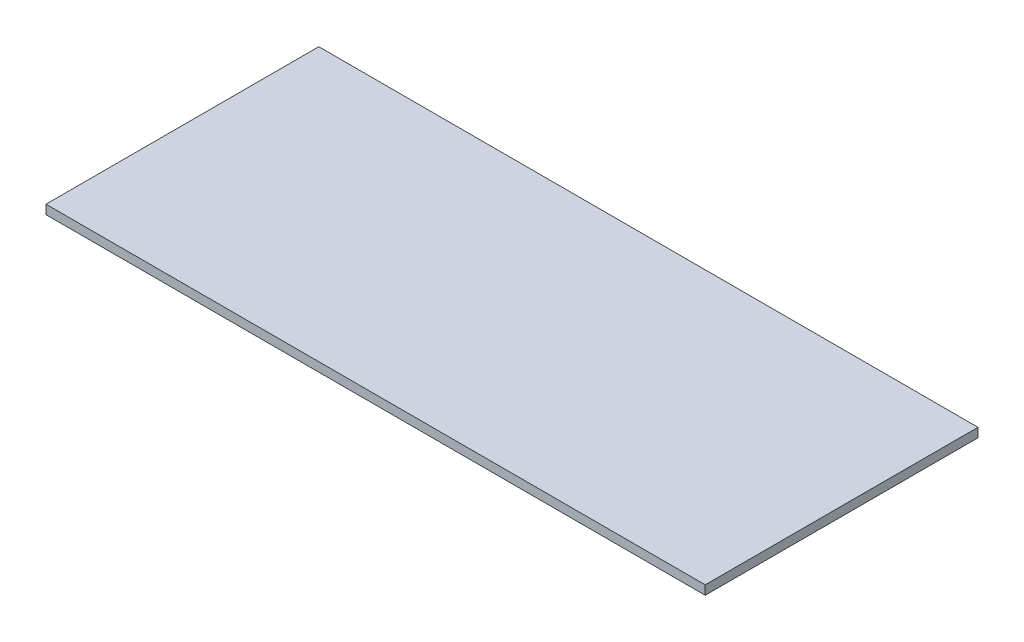
ISO-10303-21;
HEADER;
FILE_DESCRIPTION(('STEP AP214'),'2;1');
FILE_NAME('part.step','',(''),(''),'','','');
FILE_SCHEMA(('AUTOMOTIVE_DESIGN { 1 0 10303 214 1 1 1 1 }'));
ENDSEC;
DATA;
#1=APPLICATION_CONTEXT('core data for automotive mechanical design processes');
#2=APPLICATION_PROTOCOL_DEFINITION('international standard','automotive_design',2000,#1);
#3=PRODUCT_CONTEXT('',#1,'mechanical');
#4=PRODUCT('Part','Part','',(#3));
#5=PRODUCT_RELATED_PRODUCT_CATEGORY('part','',(#4));
#6=PRODUCT_DEFINITION_FORMATION('','',#4);
#7=PRODUCT_DEFINITION_CONTEXT('part definition',#1,'design');
#8=PRODUCT_DEFINITION('design','',#6,#7);
#9=PRODUCT_DEFINITION_SHAPE('','',#8);
#10=(LENGTH_UNIT() NAMED_UNIT(*) SI_UNIT(.MILLI.,.METRE.));
#11=(NAMED_UNIT(*) PLANE_ANGLE_UNIT() SI_UNIT($,.RADIAN.));
#12=(NAMED_UNIT(*) SI_UNIT($,.STERADIAN.) SOLID_ANGLE_UNIT());
#13=UNCERTAINTY_MEASURE_WITH_UNIT(LENGTH_MEASURE(1.E-05),#10,'distance_accuracy_value','');
#14=(GEOMETRIC_REPRESENTATION_CONTEXT(3) GLOBAL_UNCERTAINTY_ASSIGNED_CONTEXT((#13)) GLOBAL_UNIT_ASSIGNED_CONTEXT((#10,
#11,#12)) REPRESENTATION_CONTEXT('',''));
#15=CARTESIAN_POINT('',(0.,0.,0.));
#16=DIRECTION('',(0.,0.,1.));
#17=DIRECTION('',(1.,0.,0.));
#18=AXIS2_PLACEMENT_3D('',#15,#16,#17);
#19=CARTESIAN_POINT('',(72.5,1.,-30.));
#20=DIRECTION('',(-1.,0.,0.));
#21=DIRECTION('',(0.,0.,1.));
#22=AXIS2_PLACEMENT_3D('',#19,#20,#21);
#23=PLANE('',#22);
#24=DIRECTION('',(0.,0.,-1.));
#25=VECTOR('',#24,1.);
#26=CARTESIAN_POINT('',(72.5,-1.,-30.));
#27=LINE('',#26,#25);
#28=CARTESIAN_POINT('',(72.5,-1.,30.));
#29=VERTEX_POINT('',#28);
#30=CARTESIAN_POINT('',(72.5,-1.,-30.));
#31=VERTEX_POINT('',#30);
#32=EDGE_CURVE('E96',#29,#31,#27,.T.);
#33=ORIENTED_EDGE('',*,*,#32,.T.);
#34=DIRECTION('',(0.,-1.,0.));
#35=VECTOR('',#34,1.);
#36=CARTESIAN_POINT('',(72.5,1.,-30.));
#37=LINE('',#36,#35);
#38=CARTESIAN_POINT('',(72.5,1.,-30.));
#39=VERTEX_POINT('',#38);
#40=EDGE_CURVE('E11',#39,#31,#37,.T.);
#41=ORIENTED_EDGE('',*,*,#40,.F.);
#42=DIRECTION('',(0.,0.,-1.));
#43=VECTOR('',#42,1.);
#44=CARTESIAN_POINT('',(72.5,1.,-30.));
#45=LINE('',#44,#43);
#46=CARTESIAN_POINT('',(72.5,1.,30.));
#47=VERTEX_POINT('',#46);
#48=EDGE_CURVE('E84',#47,#39,#45,.T.);
#49=ORIENTED_EDGE('',*,*,#48,.F.);
#50=DIRECTION('',(0.,-1.,0.));
#51=VECTOR('',#50,1.);
#52=CARTESIAN_POINT('',(72.5,1.,30.));
#53=LINE('',#52,#51);
#54=EDGE_CURVE('E92',#47,#29,#53,.T.);
#55=ORIENTED_EDGE('',*,*,#54,.T.);
#56=EDGE_LOOP('',(#33,#41,#49,#55));
#57=FACE_BOUND('',#56,.T.);
#58=ADVANCED_FACE('F33',(#57),#23,.F.);
#59=CARTESIAN_POINT('',(-72.5,1.,-30.));
#60=DIRECTION('',(0.,0.,1.));
#61=DIRECTION('',(1.,0.,0.));
#62=AXIS2_PLACEMENT_3D('',#59,#60,#61);
#63=PLANE('',#62);
#64=DIRECTION('',(-1.,0.,0.));
#65=VECTOR('',#64,1.);
#66=CARTESIAN_POINT('',(-72.5,-1.,-30.));
#67=LINE('',#66,#65);
#68=CARTESIAN_POINT('',(-72.5,-1.,-30.));
#69=VERTEX_POINT('',#68);
#70=EDGE_CURVE('E88',#31,#69,#67,.T.);
#71=ORIENTED_EDGE('',*,*,#70,.T.);
#72=DIRECTION('',(0.,-1.,0.));
#73=VECTOR('',#72,1.);
#74=CARTESIAN_POINT('',(-72.5,1.,-30.));
#75=LINE('',#74,#73);
#76=CARTESIAN_POINT('',(-72.5,1.,-30.));
#77=VERTEX_POINT('',#76);
#78=EDGE_CURVE('E41',#77,#69,#75,.T.);
#79=ORIENTED_EDGE('',*,*,#78,.F.);
#80=DIRECTION('',(-1.,0.,0.));
#81=VECTOR('',#80,1.);
#82=CARTESIAN_POINT('',(-72.5,1.,-30.));
#83=LINE('',#82,#81);
#84=EDGE_CURVE('E79',#39,#77,#83,.T.);
#85=ORIENTED_EDGE('',*,*,#84,.F.);
#86=ORIENTED_EDGE('',*,*,#40,.T.);
#87=EDGE_LOOP('',(#71,#79,#85,#86));
#88=FACE_BOUND('',#87,.T.);
#89=ADVANCED_FACE('F87',(#88),#63,.F.);
#90=CARTESIAN_POINT('',(-72.5,1.,-30.));
#91=DIRECTION('',(1.,0.,0.));
#92=DIRECTION('',(0.,0.,-1.));
#93=AXIS2_PLACEMENT_3D('',#90,#91,#92);
#94=PLANE('',#93);
#95=DIRECTION('',(0.,0.,1.));
#96=VECTOR('',#95,1.);
#97=CARTESIAN_POINT('',(-72.5,-1.,-30.));
#98=LINE('',#97,#96);
#99=CARTESIAN_POINT('',(-72.5,-1.,30.));
#100=VERTEX_POINT('',#99);
#101=EDGE_CURVE('E66',#69,#100,#98,.T.);
#102=ORIENTED_EDGE('',*,*,#101,.T.);
#103=DIRECTION('',(0.,-1.,0.));
#104=VECTOR('',#103,1.);
#105=CARTESIAN_POINT('',(-72.5,1.,30.));
#106=LINE('',#105,#104);
#107=CARTESIAN_POINT('',(-72.5,1.,30.));
#108=VERTEX_POINT('',#107);
#109=EDGE_CURVE('E89',#108,#100,#106,.T.);
#110=ORIENTED_EDGE('',*,*,#109,.F.);
#111=DIRECTION('',(0.,0.,1.));
#112=VECTOR('',#111,1.);
#113=CARTESIAN_POINT('',(-72.5,1.,-30.));
#114=LINE('',#113,#112);
#115=EDGE_CURVE('E82',#77,#108,#114,.T.);
#116=ORIENTED_EDGE('',*,*,#115,.F.);
#117=ORIENTED_EDGE('',*,*,#78,.T.);
#118=EDGE_LOOP('',(#102,#110,#116,#117));
#119=FACE_BOUND('',#118,.T.);
#120=ADVANCED_FACE('F90',(#119),#94,.F.);
#121=CARTESIAN_POINT('',(-72.5,1.,30.));
#122=DIRECTION('',(0.,0.,-1.));
#123=DIRECTION('',(-1.,0.,0.));
#124=AXIS2_PLACEMENT_3D('',#121,#122,#123);
#125=PLANE('',#124);
#126=DIRECTION('',(1.,0.,0.));
#127=VECTOR('',#126,1.);
#128=CARTESIAN_POINT('',(-72.5,-1.,30.));
#129=LINE('',#128,#127);
#130=EDGE_CURVE('E72',#100,#29,#129,.T.);
#131=ORIENTED_EDGE('',*,*,#130,.T.);
#132=ORIENTED_EDGE('',*,*,#54,.F.);
#133=DIRECTION('',(1.,0.,0.));
#134=VECTOR('',#133,1.);
#135=CARTESIAN_POINT('',(-72.5,1.,30.));
#136=LINE('',#135,#134);
#137=EDGE_CURVE('E49',#108,#47,#136,.T.);
#138=ORIENTED_EDGE('',*,*,#137,.F.);
#139=ORIENTED_EDGE('',*,*,#109,.T.);
#140=EDGE_LOOP('',(#131,#132,#138,#139));
#141=FACE_BOUND('',#140,.T.);
#142=ADVANCED_FACE('F103',(#141),#125,.F.);
#143=CARTESIAN_POINT('',(0.,1.,0.));
#144=DIRECTION('',(0.,1.,0.));
#145=DIRECTION('',(0.,0.,1.));
#146=AXIS2_PLACEMENT_3D('',#143,#144,#145);
#147=PLANE('',#146);
#148=ORIENTED_EDGE('',*,*,#48,.T.);
#149=ORIENTED_EDGE('',*,*,#84,.T.);
#150=ORIENTED_EDGE('',*,*,#115,.T.);
#151=ORIENTED_EDGE('',*,*,#137,.T.);
#152=EDGE_LOOP('',(#148,#149,#150,#151));
#153=FACE_BOUND('',#152,.T.);
#154=ADVANCED_FACE('F80',(#153),#147,.T.);
#155=CARTESIAN_POINT('',(0.,-1.,0.));
#156=DIRECTION('',(0.,1.,0.));
#157=DIRECTION('',(0.,0.,1.));
#158=AXIS2_PLACEMENT_3D('',#155,#156,#157);
#159=PLANE('',#158);
#160=ORIENTED_EDGE('',*,*,#32,.F.);
#161=ORIENTED_EDGE('',*,*,#130,.F.);
#162=ORIENTED_EDGE('',*,*,#101,.F.);
#163=ORIENTED_EDGE('',*,*,#70,.F.);
#164=EDGE_LOOP('',(#160,#161,#162,#163));
#165=FACE_BOUND('',#164,.T.);
#166=ADVANCED_FACE('F106',(#165),#159,.F.);
#167=CLOSED_SHELL('',(#58,#89,#120,#142,#154,#166));
#168=MANIFOLD_SOLID_BREP('B2',#167);
#169=ADVANCED_BREP_SHAPE_REPRESENTATION('',(#18,#168),#14);
#170=SHAPE_DEFINITION_REPRESENTATION(#9,#169);
ENDSEC;
END-ISO-10303-21;
